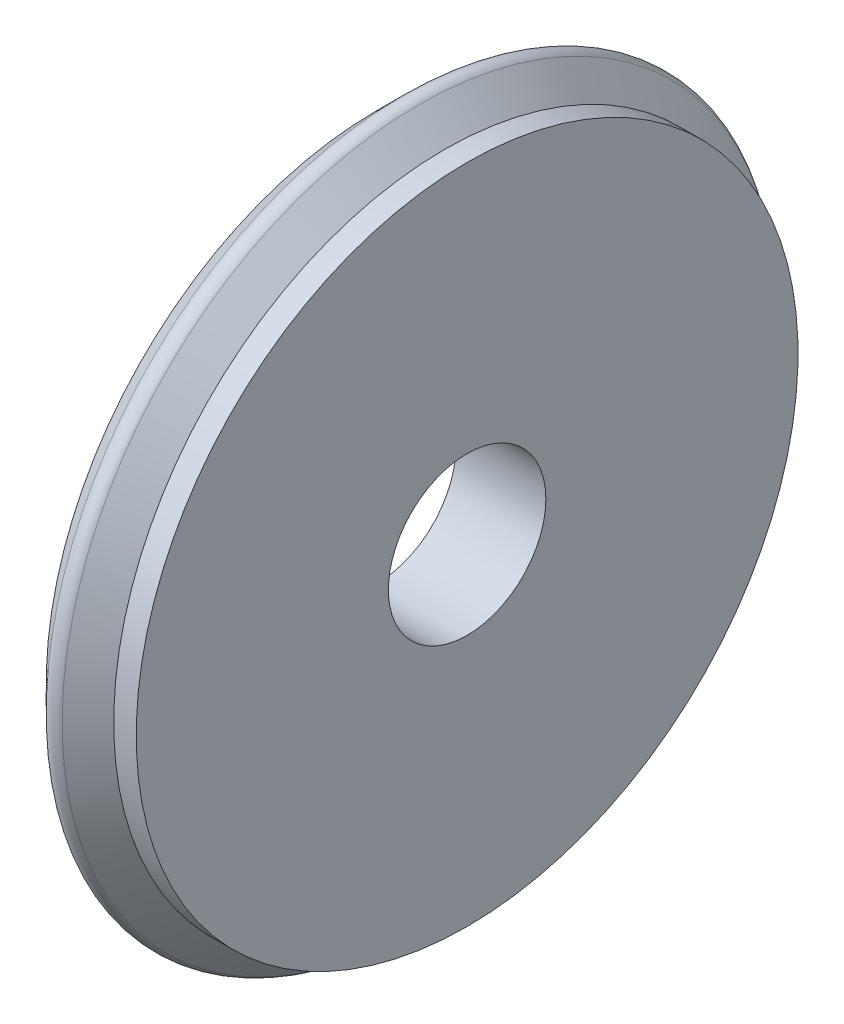
ISO-10303-21;
HEADER;
FILE_DESCRIPTION(('STEP AP214'),'2;1');
FILE_NAME('part.step','',(''),(''),'','','');
FILE_SCHEMA(('AUTOMOTIVE_DESIGN { 1 0 10303 214 1 1 1 1 }'));
ENDSEC;
DATA;
#1=APPLICATION_CONTEXT('core data for automotive mechanical design processes');
#2=APPLICATION_PROTOCOL_DEFINITION('international standard','automotive_design',2000,#1);
#3=PRODUCT_CONTEXT('',#1,'mechanical');
#4=PRODUCT('Part','Part','',(#3));
#5=PRODUCT_RELATED_PRODUCT_CATEGORY('part','',(#4));
#6=PRODUCT_DEFINITION_FORMATION('','',#4);
#7=PRODUCT_DEFINITION_CONTEXT('part definition',#1,'design');
#8=PRODUCT_DEFINITION('design','',#6,#7);
#9=PRODUCT_DEFINITION_SHAPE('','',#8);
#10=(LENGTH_UNIT() NAMED_UNIT(*) SI_UNIT(.MILLI.,.METRE.));
#11=(NAMED_UNIT(*) PLANE_ANGLE_UNIT() SI_UNIT($,.RADIAN.));
#12=(NAMED_UNIT(*) SI_UNIT($,.STERADIAN.) SOLID_ANGLE_UNIT());
#13=UNCERTAINTY_MEASURE_WITH_UNIT(LENGTH_MEASURE(1.E-05),#10,'distance_accuracy_value','');
#14=(GEOMETRIC_REPRESENTATION_CONTEXT(3) GLOBAL_UNCERTAINTY_ASSIGNED_CONTEXT((#13)) GLOBAL_UNIT_ASSIGNED_CONTEXT((#10,
#11,#12)) REPRESENTATION_CONTEXT('',''));
#15=CARTESIAN_POINT('',(0.,0.,0.));
#16=DIRECTION('',(0.,0.,1.));
#17=DIRECTION('',(1.,0.,0.));
#18=AXIS2_PLACEMENT_3D('',#15,#16,#17);
#19=CARTESIAN_POINT('',(1.14644660940672,0.,0.));
#20=DIRECTION('',(1.,0.,0.));
#21=DIRECTION('',(0.,1.,0.));
#22=AXIS2_PLACEMENT_3D('',#19,#20,#21);
#23=CONICAL_SURFACE('',#22,15.8535533905933,0.78539816339745);
#24=CARTESIAN_POINT('',(0.,0.,0.));
#25=DIRECTION('',(-1.,0.,0.));
#26=DIRECTION('',(0.,-1.,0.));
#27=AXIS2_PLACEMENT_3D('',#24,#25,#26);
#28=CIRCLE('',#27,14.7071067811865);
#29=CARTESIAN_POINT('',(0.,-14.7071067811865,0.));
#30=VERTEX_POINT('',#29);
#31=EDGE_CURVE('E49',#30,#30,#28,.T.);
#32=ORIENTED_EDGE('',*,*,#31,.F.);
#33=EDGE_LOOP('',(#32));
#34=FACE_BOUND('',#33,.T.);
#35=CARTESIAN_POINT('',(1.14644660940672,0.,0.));
#36=DIRECTION('',(-1.,0.,0.));
#37=DIRECTION('',(0.,-1.,0.));
#38=AXIS2_PLACEMENT_3D('',#35,#36,#37);
#39=CIRCLE('',#38,15.8535533905933);
#40=CARTESIAN_POINT('',(1.14644660940672,-15.8535533905933,0.));
#41=VERTEX_POINT('',#40);
#42=EDGE_CURVE('E10',#41,#41,#39,.T.);
#43=ORIENTED_EDGE('',*,*,#42,.T.);
#44=EDGE_LOOP('',(#43));
#45=FACE_BOUND('',#44,.T.);
#46=ADVANCED_FACE('F30',(#34,#45),#23,.T.);
#47=CARTESIAN_POINT('',(1.5,0.,0.));
#48=DIRECTION('',(-1.,0.,0.));
#49=DIRECTION('',(0.,-1.,0.));
#50=AXIS2_PLACEMENT_3D('',#47,#48,#49);
#51=TOROIDAL_SURFACE('',#50,15.5,0.499999999999999);
#52=ORIENTED_EDGE('',*,*,#42,.F.);
#53=EDGE_LOOP('',(#52));
#54=FACE_BOUND('',#53,.T.);
#55=CARTESIAN_POINT('',(1.85355339059327,0.,0.));
#56=DIRECTION('',(-1.,0.,0.));
#57=DIRECTION('',(0.,-1.,0.));
#58=AXIS2_PLACEMENT_3D('',#55,#56,#57);
#59=CIRCLE('',#58,15.8535533905933);
#60=CARTESIAN_POINT('',(1.85355339059327,-15.8535533905933,0.));
#61=VERTEX_POINT('',#60);
#62=EDGE_CURVE('E36',#61,#61,#59,.T.);
#63=ORIENTED_EDGE('',*,*,#62,.T.);
#64=EDGE_LOOP('',(#63));
#65=FACE_BOUND('',#64,.T.);
#66=ADVANCED_FACE('F76',(#54,#65),#51,.T.);
#67=CARTESIAN_POINT('',(3.,0.,0.));
#68=DIRECTION('',(-1.,0.,0.));
#69=DIRECTION('',(0.,-1.,0.));
#70=AXIS2_PLACEMENT_3D('',#67,#68,#69);
#71=CONICAL_SURFACE('',#70,14.7071067811865,0.78539816339745);
#72=ORIENTED_EDGE('',*,*,#62,.F.);
#73=EDGE_LOOP('',(#72));
#74=FACE_BOUND('',#73,.T.);
#75=CARTESIAN_POINT('',(3.,0.,0.));
#76=DIRECTION('',(-1.,0.,0.));
#77=DIRECTION('',(0.,-1.,0.));
#78=AXIS2_PLACEMENT_3D('',#75,#76,#77);
#79=CIRCLE('',#78,14.7071067811865);
#80=CARTESIAN_POINT('',(3.,-14.7071067811865,0.));
#81=VERTEX_POINT('',#80);
#82=EDGE_CURVE('E40',#81,#81,#79,.T.);
#83=ORIENTED_EDGE('',*,*,#82,.T.);
#84=EDGE_LOOP('',(#83));
#85=FACE_BOUND('',#84,.T.);
#86=ADVANCED_FACE('F70',(#74,#85),#71,.T.);
#87=CARTESIAN_POINT('',(0.,0.,0.));
#88=DIRECTION('',(-1.,0.,0.));
#89=DIRECTION('',(0.,-1.,0.));
#90=AXIS2_PLACEMENT_3D('',#87,#88,#89);
#91=CYLINDRICAL_SURFACE('',#90,14.7071067811865);
#92=ORIENTED_EDGE('',*,*,#82,.F.);
#93=EDGE_LOOP('',(#92));
#94=FACE_BOUND('',#93,.T.);
#95=CARTESIAN_POINT('',(4.,0.,0.));
#96=DIRECTION('',(-1.,0.,0.));
#97=DIRECTION('',(0.,-1.,0.));
#98=AXIS2_PLACEMENT_3D('',#95,#96,#97);
#99=CIRCLE('',#98,14.7071067811865);
#100=CARTESIAN_POINT('',(4.,-14.7071067811865,0.));
#101=VERTEX_POINT('',#100);
#102=EDGE_CURVE('E44',#101,#101,#99,.T.);
#103=ORIENTED_EDGE('',*,*,#102,.T.);
#104=EDGE_LOOP('',(#103));
#105=FACE_BOUND('',#104,.T.);
#106=ADVANCED_FACE('F65',(#94,#105),#91,.T.);
#107=CARTESIAN_POINT('',(4.,14.7071067811865,0.));
#108=DIRECTION('',(-1.,0.,0.));
#109=DIRECTION('',(0.,-1.,0.));
#110=AXIS2_PLACEMENT_3D('',#107,#108,#109);
#111=PLANE('',#110);
#112=CARTESIAN_POINT('',(4.,0.,0.));
#113=DIRECTION('',(1.,0.,0.));
#114=DIRECTION('',(0.,0.,-1.));
#115=AXIS2_PLACEMENT_3D('',#112,#113,#114);
#116=CIRCLE('',#115,3.5);
#117=CARTESIAN_POINT('',(4.,0.,-3.5));
#118=VERTEX_POINT('',#117);
#119=EDGE_CURVE('E55',#118,#118,#116,.T.);
#120=ORIENTED_EDGE('',*,*,#119,.F.);
#121=EDGE_LOOP('',(#120));
#122=FACE_BOUND('',#121,.T.);
#123=ORIENTED_EDGE('',*,*,#102,.F.);
#124=EDGE_LOOP('',(#123));
#125=FACE_BOUND('',#124,.T.);
#126=ADVANCED_FACE('F61',(#122,#125),#111,.F.);
#127=CARTESIAN_POINT('',(0.,0.,0.));
#128=DIRECTION('',(1.,0.,0.));
#129=DIRECTION('',(0.,1.,0.));
#130=AXIS2_PLACEMENT_3D('',#127,#128,#129);
#131=PLANE('',#130);
#132=CARTESIAN_POINT('',(0.,0.,0.));
#133=DIRECTION('',(1.,0.,0.));
#134=DIRECTION('',(0.,0.,-1.));
#135=AXIS2_PLACEMENT_3D('',#132,#133,#134);
#136=CIRCLE('',#135,3.5);
#137=CARTESIAN_POINT('',(0.,0.,-3.5));
#138=VERTEX_POINT('',#137);
#139=EDGE_CURVE('E52',#138,#138,#136,.T.);
#140=ORIENTED_EDGE('',*,*,#139,.T.);
#141=EDGE_LOOP('',(#140));
#142=FACE_BOUND('',#141,.T.);
#143=ORIENTED_EDGE('',*,*,#31,.T.);
#144=EDGE_LOOP('',(#143));
#145=FACE_BOUND('',#144,.T.);
#146=ADVANCED_FACE('F64',(#142,#145),#131,.F.);
#147=CARTESIAN_POINT('',(4.,0.,0.));
#148=DIRECTION('',(1.,0.,0.));
#149=DIRECTION('',(0.,0.,-1.));
#150=AXIS2_PLACEMENT_3D('',#147,#148,#149);
#151=CYLINDRICAL_SURFACE('',#150,3.5);
#152=ORIENTED_EDGE('',*,*,#139,.F.);
#153=EDGE_LOOP('',(#152));
#154=FACE_BOUND('',#153,.T.);
#155=ORIENTED_EDGE('',*,*,#119,.T.);
#156=EDGE_LOOP('',(#155));
#157=FACE_BOUND('',#156,.T.);
#158=ADVANCED_FACE('F59',(#154,#157),#151,.F.);
#159=CLOSED_SHELL('',(#46,#66,#86,#106,#126,#146,#158));
#160=MANIFOLD_SOLID_BREP('B2',#159);
#161=ADVANCED_BREP_SHAPE_REPRESENTATION('',(#18,#160),#14);
#162=SHAPE_DEFINITION_REPRESENTATION(#9,#161);
ENDSEC;
END-ISO-10303-21;
